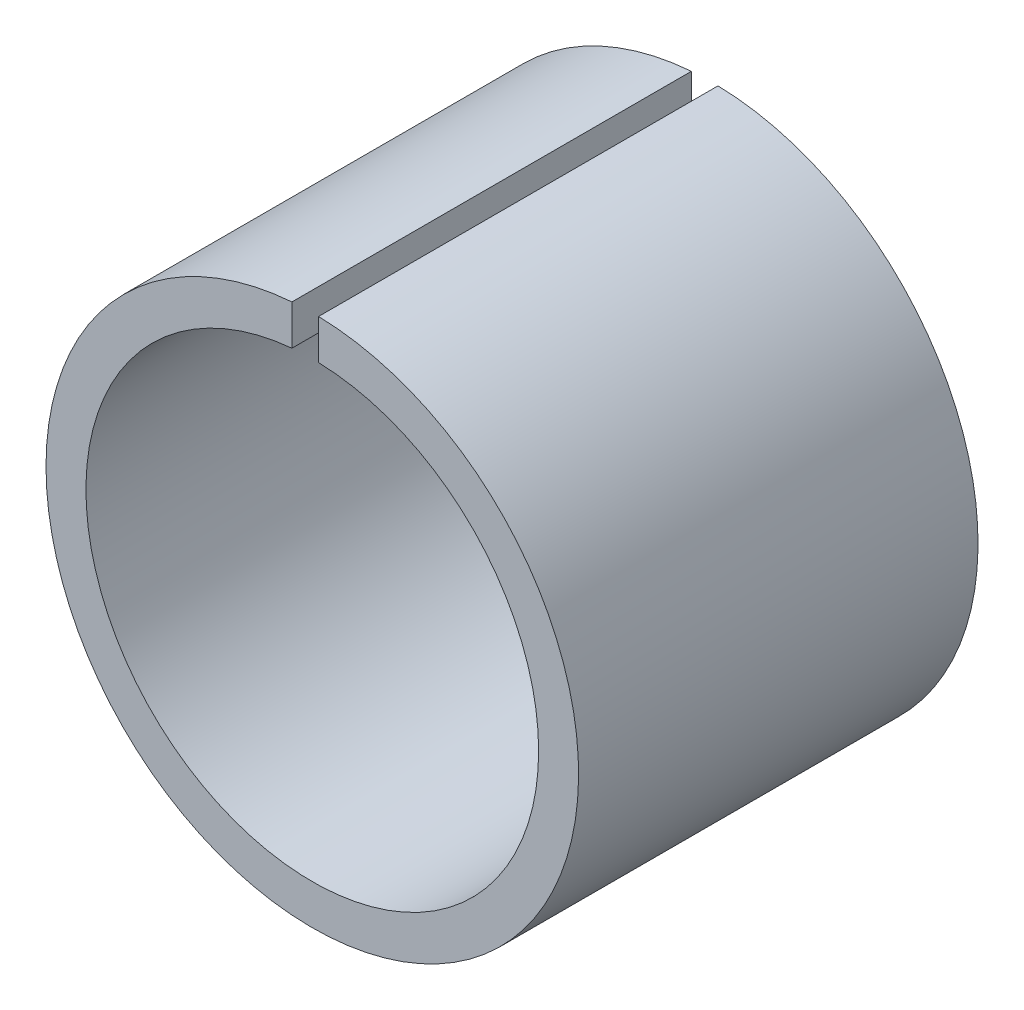
ISO-10303-21;
HEADER;
FILE_DESCRIPTION(('STEP AP214'),'2;1');
FILE_NAME('part.step','',(''),(''),'','','');
FILE_SCHEMA(('AUTOMOTIVE_DESIGN { 1 0 10303 214 1 1 1 1 }'));
ENDSEC;
DATA;
#1=APPLICATION_CONTEXT('core data for automotive mechanical design processes');
#2=APPLICATION_PROTOCOL_DEFINITION('international standard','automotive_design',2000,#1);
#3=PRODUCT_CONTEXT('',#1,'mechanical');
#4=PRODUCT('Part','Part','',(#3));
#5=PRODUCT_RELATED_PRODUCT_CATEGORY('part','',(#4));
#6=PRODUCT_DEFINITION_FORMATION('','',#4);
#7=PRODUCT_DEFINITION_CONTEXT('part definition',#1,'design');
#8=PRODUCT_DEFINITION('design','',#6,#7);
#9=PRODUCT_DEFINITION_SHAPE('','',#8);
#10=(LENGTH_UNIT() NAMED_UNIT(*) SI_UNIT(.MILLI.,.METRE.));
#11=(NAMED_UNIT(*) PLANE_ANGLE_UNIT() SI_UNIT($,.RADIAN.));
#12=(NAMED_UNIT(*) SI_UNIT($,.STERADIAN.) SOLID_ANGLE_UNIT());
#13=UNCERTAINTY_MEASURE_WITH_UNIT(LENGTH_MEASURE(1.E-05),#10,'distance_accuracy_value','');
#14=(GEOMETRIC_REPRESENTATION_CONTEXT(3) GLOBAL_UNCERTAINTY_ASSIGNED_CONTEXT((#13)) GLOBAL_UNIT_ASSIGNED_CONTEXT((#10,
#11,#12)) REPRESENTATION_CONTEXT('',''));
#15=CARTESIAN_POINT('',(0.,0.,0.));
#16=DIRECTION('',(0.,0.,1.));
#17=DIRECTION('',(1.,0.,0.));
#18=AXIS2_PLACEMENT_3D('',#15,#16,#17);
#19=CARTESIAN_POINT('',(0.,0.,15.));
#20=DIRECTION('',(0.,0.,-1.));
#21=DIRECTION('',(-1.,0.,0.));
#22=AXIS2_PLACEMENT_3D('',#19,#20,#21);
#23=CYLINDRICAL_SURFACE('',#22,10.);
#24=DIRECTION('',(0.,0.,-1.));
#25=VECTOR('',#24,1.);
#26=CARTESIAN_POINT('',(-0.765251335992104,9.97067652633272,15.));
#27=LINE('',#26,#25);
#28=CARTESIAN_POINT('',(-0.765251335992104,9.97067652633272,0.));
#29=VERTEX_POINT('',#28);
#30=CARTESIAN_POINT('',(-0.765251335992104,9.97067652633272,15.));
#31=VERTEX_POINT('',#30);
#32=EDGE_CURVE('E76',#29,#31,#27,.F.);
#33=ORIENTED_EDGE('',*,*,#32,.F.);
#34=CARTESIAN_POINT('',(0.,0.,0.));
#35=DIRECTION('',(0.,0.,1.));
#36=DIRECTION('',(1.,0.,0.));
#37=AXIS2_PLACEMENT_3D('',#34,#35,#36);
#38=CIRCLE('',#37,10.);
#39=CARTESIAN_POINT('',(0.234748664007892,9.99724427353591,0.));
#40=VERTEX_POINT('',#39);
#41=EDGE_CURVE('E86',#29,#40,#38,.T.);
#42=ORIENTED_EDGE('',*,*,#41,.T.);
#43=DIRECTION('',(0.,0.,-1.));
#44=VECTOR('',#43,1.);
#45=CARTESIAN_POINT('',(0.234748664007896,9.99724427353591,15.));
#46=LINE('',#45,#44);
#47=CARTESIAN_POINT('',(0.234748664007896,9.99724427353591,15.));
#48=VERTEX_POINT('',#47);
#49=EDGE_CURVE('E90',#48,#40,#46,.T.);
#50=ORIENTED_EDGE('',*,*,#49,.F.);
#51=CARTESIAN_POINT('',(0.,0.,15.));
#52=DIRECTION('',(0.,0.,1.));
#53=DIRECTION('',(1.,0.,0.));
#54=AXIS2_PLACEMENT_3D('',#51,#52,#53);
#55=CIRCLE('',#54,10.);
#56=EDGE_CURVE('E88',#31,#48,#55,.T.);
#57=ORIENTED_EDGE('',*,*,#56,.F.);
#58=EDGE_LOOP('',(#33,#42,#50,#57));
#59=FACE_BOUND('',#58,.T.);
#60=ADVANCED_FACE('F36',(#59),#23,.T.);
#61=CARTESIAN_POINT('',(0.,0.,15.));
#62=DIRECTION('',(0.,0.,1.));
#63=DIRECTION('',(1.,0.,0.));
#64=AXIS2_PLACEMENT_3D('',#61,#62,#63);
#65=PLANE('',#64);
#66=CARTESIAN_POINT('',(0.,0.,15.));
#67=DIRECTION('',(0.,0.,1.));
#68=DIRECTION('',(1.,0.,0.));
#69=AXIS2_PLACEMENT_3D('',#66,#67,#68);
#70=CIRCLE('',#69,8.5);
#71=CARTESIAN_POINT('',(-0.765251335992104,8.46548228943646,15.));
#72=VERTEX_POINT('',#71);
#73=CARTESIAN_POINT('',(0.234748664007896,8.49675779722751,15.));
#74=VERTEX_POINT('',#73);
#75=EDGE_CURVE('E89',#72,#74,#70,.T.);
#76=ORIENTED_EDGE('',*,*,#75,.F.);
#77=DIRECTION('',(0.,-1.,0.));
#78=VECTOR('',#77,1.);
#79=CARTESIAN_POINT('',(-0.765251335992104,11.,15.));
#80=LINE('',#79,#78);
#81=EDGE_CURVE('E57',#31,#72,#80,.T.);
#82=ORIENTED_EDGE('',*,*,#81,.F.);
#83=ORIENTED_EDGE('',*,*,#56,.T.);
#84=DIRECTION('',(0.,-1.,0.));
#85=VECTOR('',#84,1.);
#86=CARTESIAN_POINT('',(0.234748664007896,11.,15.));
#87=LINE('',#86,#85);
#88=EDGE_CURVE('E100',#48,#74,#87,.T.);
#89=ORIENTED_EDGE('',*,*,#88,.T.);
#90=EDGE_LOOP('',(#76,#82,#83,#89));
#91=FACE_BOUND('',#90,.T.);
#92=ADVANCED_FACE('F105',(#91),#65,.T.);
#93=CARTESIAN_POINT('',(0.,0.,0.));
#94=DIRECTION('',(0.,0.,1.));
#95=DIRECTION('',(1.,0.,0.));
#96=AXIS2_PLACEMENT_3D('',#93,#94,#95);
#97=PLANE('',#96);
#98=DIRECTION('',(0.,-1.,0.));
#99=VECTOR('',#98,1.);
#100=CARTESIAN_POINT('',(-0.765251335992104,11.,0.));
#101=LINE('',#100,#99);
#102=CARTESIAN_POINT('',(-0.765251335992104,8.46548228943645,0.));
#103=VERTEX_POINT('',#102);
#104=EDGE_CURVE('E73',#29,#103,#101,.T.);
#105=ORIENTED_EDGE('',*,*,#104,.T.);
#106=CARTESIAN_POINT('',(0.,0.,0.));
#107=DIRECTION('',(0.,0.,1.));
#108=DIRECTION('',(1.,0.,0.));
#109=AXIS2_PLACEMENT_3D('',#106,#107,#108);
#110=CIRCLE('',#109,8.5);
#111=CARTESIAN_POINT('',(0.234748664007892,8.49675779722751,0.));
#112=VERTEX_POINT('',#111);
#113=EDGE_CURVE('E93',#103,#112,#110,.T.);
#114=ORIENTED_EDGE('',*,*,#113,.T.);
#115=DIRECTION('',(0.,-1.,0.));
#116=VECTOR('',#115,1.);
#117=CARTESIAN_POINT('',(0.234748664007892,11.,0.));
#118=LINE('',#117,#116);
#119=EDGE_CURVE('E50',#40,#112,#118,.T.);
#120=ORIENTED_EDGE('',*,*,#119,.F.);
#121=ORIENTED_EDGE('',*,*,#41,.F.);
#122=EDGE_LOOP('',(#105,#114,#120,#121));
#123=FACE_BOUND('',#122,.T.);
#124=ADVANCED_FACE('F92',(#123),#97,.F.);
#125=CARTESIAN_POINT('',(0.,0.,-4.));
#126=DIRECTION('',(0.,0.,1.));
#127=DIRECTION('',(1.,0.,0.));
#128=AXIS2_PLACEMENT_3D('',#125,#126,#127);
#129=CYLINDRICAL_SURFACE('',#128,8.5);
#130=DIRECTION('',(0.,0.,1.));
#131=VECTOR('',#130,1.);
#132=CARTESIAN_POINT('',(-0.765251335992104,8.46548228943645,-4.));
#133=LINE('',#132,#131);
#134=EDGE_CURVE('E11',#72,#103,#133,.F.);
#135=ORIENTED_EDGE('',*,*,#134,.F.);
#136=ORIENTED_EDGE('',*,*,#75,.T.);
#137=DIRECTION('',(0.,0.,1.));
#138=VECTOR('',#137,1.);
#139=CARTESIAN_POINT('',(0.234748664007891,8.49675779722751,-4.));
#140=LINE('',#139,#138);
#141=EDGE_CURVE('E43',#112,#74,#140,.T.);
#142=ORIENTED_EDGE('',*,*,#141,.F.);
#143=ORIENTED_EDGE('',*,*,#113,.F.);
#144=EDGE_LOOP('',(#135,#136,#142,#143));
#145=FACE_BOUND('',#144,.T.);
#146=ADVANCED_FACE('F107',(#145),#129,.F.);
#147=CARTESIAN_POINT('',(0.234748664007892,11.,0.));
#148=DIRECTION('',(-1.,0.,0.));
#149=DIRECTION('',(0.,0.,1.));
#150=AXIS2_PLACEMENT_3D('',#147,#148,#149);
#151=PLANE('',#150);
#152=ORIENTED_EDGE('',*,*,#49,.T.);
#153=ORIENTED_EDGE('',*,*,#119,.T.);
#154=ORIENTED_EDGE('',*,*,#141,.T.);
#155=ORIENTED_EDGE('',*,*,#88,.F.);
#156=EDGE_LOOP('',(#152,#153,#154,#155));
#157=FACE_BOUND('',#156,.T.);
#158=ADVANCED_FACE('F99',(#157),#151,.T.);
#159=CARTESIAN_POINT('',(-0.765251335992104,11.,15.));
#160=DIRECTION('',(1.,0.,0.));
#161=DIRECTION('',(0.,0.,-1.));
#162=AXIS2_PLACEMENT_3D('',#159,#160,#161);
#163=PLANE('',#162);
#164=ORIENTED_EDGE('',*,*,#32,.T.);
#165=ORIENTED_EDGE('',*,*,#81,.T.);
#166=ORIENTED_EDGE('',*,*,#134,.T.);
#167=ORIENTED_EDGE('',*,*,#104,.F.);
#168=EDGE_LOOP('',(#164,#165,#166,#167));
#169=FACE_BOUND('',#168,.T.);
#170=ADVANCED_FACE('F75',(#169),#163,.T.);
#171=CLOSED_SHELL('',(#60,#92,#124,#146,#158,#170));
#172=MANIFOLD_SOLID_BREP('B2',#171);
#173=ADVANCED_BREP_SHAPE_REPRESENTATION('',(#18,#172),#14);
#174=SHAPE_DEFINITION_REPRESENTATION(#9,#173);
ENDSEC;
END-ISO-10303-21;
